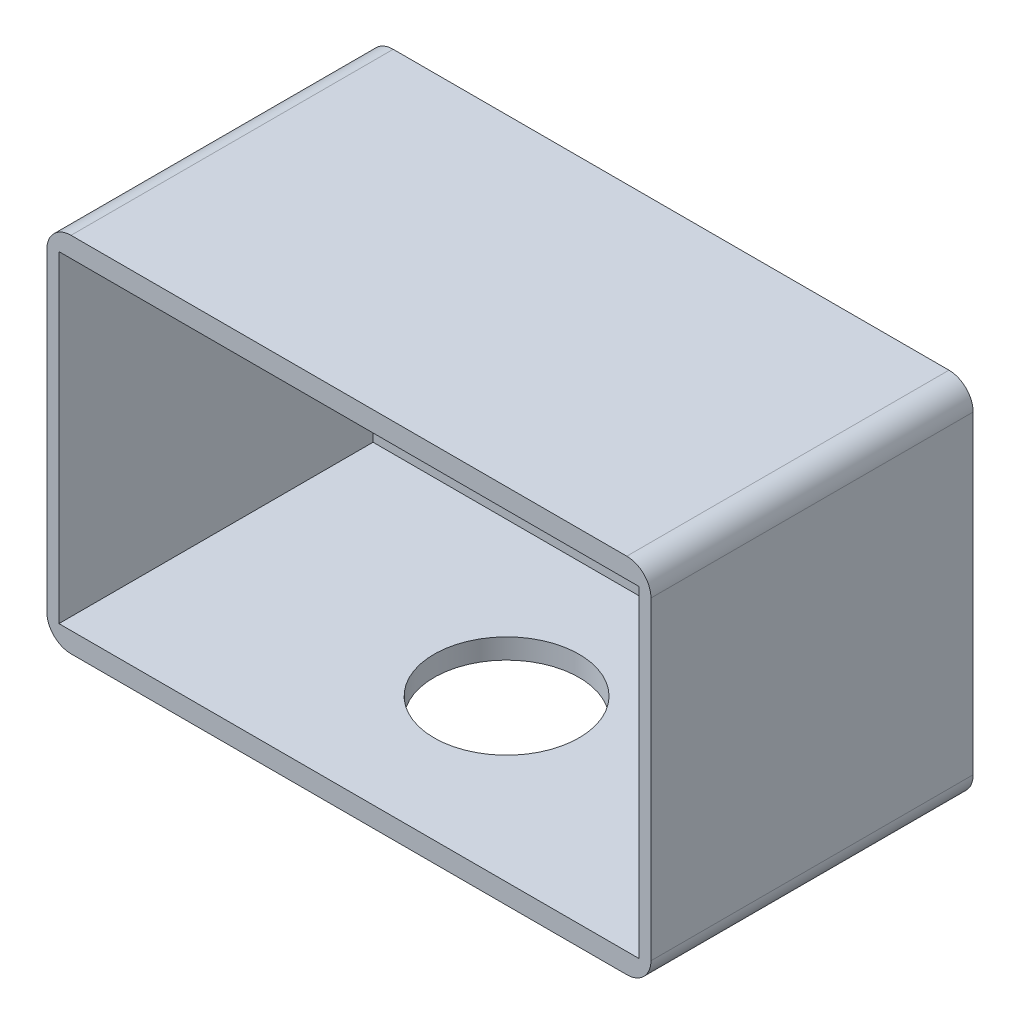
ISO-10303-21;
HEADER;
FILE_DESCRIPTION(('STEP AP214'),'2;1');
FILE_NAME('part.step','',(''),(''),'','','');
FILE_SCHEMA(('AUTOMOTIVE_DESIGN { 1 0 10303 214 1 1 1 1 }'));
ENDSEC;
DATA;
#1=APPLICATION_CONTEXT('core data for automotive mechanical design processes');
#2=APPLICATION_PROTOCOL_DEFINITION('international standard','automotive_design',2000,#1);
#3=PRODUCT_CONTEXT('',#1,'mechanical');
#4=PRODUCT('Part','Part','',(#3));
#5=PRODUCT_RELATED_PRODUCT_CATEGORY('part','',(#4));
#6=PRODUCT_DEFINITION_FORMATION('','',#4);
#7=PRODUCT_DEFINITION_CONTEXT('part definition',#1,'design');
#8=PRODUCT_DEFINITION('design','',#6,#7);
#9=PRODUCT_DEFINITION_SHAPE('','',#8);
#10=(LENGTH_UNIT() NAMED_UNIT(*) SI_UNIT(.MILLI.,.METRE.));
#11=(NAMED_UNIT(*) PLANE_ANGLE_UNIT() SI_UNIT($,.RADIAN.));
#12=(NAMED_UNIT(*) SI_UNIT($,.STERADIAN.) SOLID_ANGLE_UNIT());
#13=UNCERTAINTY_MEASURE_WITH_UNIT(LENGTH_MEASURE(1.E-05),#10,'distance_accuracy_value','');
#14=(GEOMETRIC_REPRESENTATION_CONTEXT(3) GLOBAL_UNCERTAINTY_ASSIGNED_CONTEXT((#13)) GLOBAL_UNIT_ASSIGNED_CONTEXT((#10,
#11,#12)) REPRESENTATION_CONTEXT('',''));
#15=CARTESIAN_POINT('',(0.,0.,0.));
#16=DIRECTION('',(0.,0.,1.));
#17=DIRECTION('',(1.,0.,0.));
#18=AXIS2_PLACEMENT_3D('',#15,#16,#17);
#19=CARTESIAN_POINT('',(36.,-20.,40.));
#20=DIRECTION('',(-1.,0.,0.));
#21=DIRECTION('',(0.,0.,1.));
#22=AXIS2_PLACEMENT_3D('',#19,#20,#21);
#23=PLANE('',#22);
#24=DIRECTION('',(0.,0.,-1.));
#25=VECTOR('',#24,1.);
#26=CARTESIAN_POINT('',(36.,20.,40.));
#27=LINE('',#26,#25);
#28=CARTESIAN_POINT('',(36.,20.,40.));
#29=VERTEX_POINT('',#28);
#30=CARTESIAN_POINT('',(36.,20.,1.));
#31=VERTEX_POINT('',#30);
#32=EDGE_CURVE('E134',#29,#31,#27,.T.);
#33=ORIENTED_EDGE('',*,*,#32,.T.);
#34=DIRECTION('',(0.,1.,0.));
#35=VECTOR('',#34,1.);
#36=CARTESIAN_POINT('',(36.,-20.,1.));
#37=LINE('',#36,#35);
#38=CARTESIAN_POINT('',(36.,-20.,1.));
#39=VERTEX_POINT('',#38);
#40=EDGE_CURVE('E120',#39,#31,#37,.T.);
#41=ORIENTED_EDGE('',*,*,#40,.F.);
#42=DIRECTION('',(0.,0.,-1.));
#43=VECTOR('',#42,1.);
#44=CARTESIAN_POINT('',(36.,-20.,40.));
#45=LINE('',#44,#43);
#46=CARTESIAN_POINT('',(36.,-20.,40.));
#47=VERTEX_POINT('',#46);
#48=EDGE_CURVE('E284',#47,#39,#45,.T.);
#49=ORIENTED_EDGE('',*,*,#48,.F.);
#50=DIRECTION('',(0.,1.,0.));
#51=VECTOR('',#50,1.);
#52=CARTESIAN_POINT('',(36.,-20.,40.));
#53=LINE('',#52,#51);
#54=EDGE_CURVE('E140',#47,#29,#53,.T.);
#55=ORIENTED_EDGE('',*,*,#54,.T.);
#56=EDGE_LOOP('',(#33,#41,#49,#55));
#57=FACE_BOUND('',#56,.T.);
#58=ADVANCED_FACE('F33',(#57),#23,.T.);
#59=CARTESIAN_POINT('',(-36.,20.,40.));
#60=DIRECTION('',(0.,-1.,0.));
#61=DIRECTION('',(0.,0.,-1.));
#62=AXIS2_PLACEMENT_3D('',#59,#60,#61);
#63=PLANE('',#62);
#64=DIRECTION('',(0.,0.,-1.));
#65=VECTOR('',#64,1.);
#66=CARTESIAN_POINT('',(-36.,20.,40.));
#67=LINE('',#66,#65);
#68=CARTESIAN_POINT('',(-36.,20.,40.));
#69=VERTEX_POINT('',#68);
#70=CARTESIAN_POINT('',(-36.,20.,1.));
#71=VERTEX_POINT('',#70);
#72=EDGE_CURVE('E137',#69,#71,#67,.T.);
#73=ORIENTED_EDGE('',*,*,#72,.T.);
#74=DIRECTION('',(-1.,0.,0.));
#75=VECTOR('',#74,1.);
#76=CARTESIAN_POINT('',(-36.,20.,1.));
#77=LINE('',#76,#75);
#78=EDGE_CURVE('E123',#31,#71,#77,.T.);
#79=ORIENTED_EDGE('',*,*,#78,.F.);
#80=ORIENTED_EDGE('',*,*,#32,.F.);
#81=DIRECTION('',(-1.,0.,0.));
#82=VECTOR('',#81,1.);
#83=CARTESIAN_POINT('',(-36.,20.,40.));
#84=LINE('',#83,#82);
#85=EDGE_CURVE('E290',#29,#69,#84,.T.);
#86=ORIENTED_EDGE('',*,*,#85,.T.);
#87=EDGE_LOOP('',(#73,#79,#80,#86));
#88=FACE_BOUND('',#87,.T.);
#89=ADVANCED_FACE('F133',(#88),#63,.T.);
#90=CARTESIAN_POINT('',(-36.,-20.,40.));
#91=DIRECTION('',(1.,0.,0.));
#92=DIRECTION('',(0.,0.,-1.));
#93=AXIS2_PLACEMENT_3D('',#90,#91,#92);
#94=PLANE('',#93);
#95=DIRECTION('',(0.,0.,-1.));
#96=VECTOR('',#95,1.);
#97=CARTESIAN_POINT('',(-36.,-20.,40.));
#98=LINE('',#97,#96);
#99=CARTESIAN_POINT('',(-36.,-20.,40.));
#100=VERTEX_POINT('',#99);
#101=CARTESIAN_POINT('',(-36.,-20.,1.));
#102=VERTEX_POINT('',#101);
#103=EDGE_CURVE('E55',#100,#102,#98,.T.);
#104=ORIENTED_EDGE('',*,*,#103,.T.);
#105=DIRECTION('',(0.,-1.,0.));
#106=VECTOR('',#105,1.);
#107=CARTESIAN_POINT('',(-36.,-20.,1.));
#108=LINE('',#107,#106);
#109=EDGE_CURVE('E48',#71,#102,#108,.T.);
#110=ORIENTED_EDGE('',*,*,#109,.F.);
#111=ORIENTED_EDGE('',*,*,#72,.F.);
#112=DIRECTION('',(0.,-1.,0.));
#113=VECTOR('',#112,1.);
#114=CARTESIAN_POINT('',(-36.,-20.,40.));
#115=LINE('',#114,#113);
#116=EDGE_CURVE('E282',#69,#100,#115,.T.);
#117=ORIENTED_EDGE('',*,*,#116,.T.);
#118=EDGE_LOOP('',(#104,#110,#111,#117));
#119=FACE_BOUND('',#118,.T.);
#120=ADVANCED_FACE('F252',(#119),#94,.T.);
#121=CARTESIAN_POINT('',(-36.,-20.,40.));
#122=DIRECTION('',(0.,1.,0.));
#123=DIRECTION('',(0.,0.,1.));
#124=AXIS2_PLACEMENT_3D('',#121,#122,#123);
#125=PLANE('',#124);
#126=CARTESIAN_POINT('',(-0.425108749877515,-20.,20.));
#127=DIRECTION('',(0.,1.,0.));
#128=DIRECTION('',(0.,0.,1.));
#129=AXIS2_PLACEMENT_3D('',#126,#127,#128);
#130=CIRCLE('',#129,9.);
#131=CARTESIAN_POINT('',(-0.425108749877515,-20.,29.));
#132=VERTEX_POINT('',#131);
#133=EDGE_CURVE('E296',#132,#132,#130,.T.);
#134=ORIENTED_EDGE('',*,*,#133,.F.);
#135=EDGE_LOOP('',(#134));
#136=FACE_BOUND('',#135,.T.);
#137=ORIENTED_EDGE('',*,*,#48,.T.);
#138=DIRECTION('',(1.,0.,0.));
#139=VECTOR('',#138,1.);
#140=CARTESIAN_POINT('',(-36.,-20.,1.));
#141=LINE('',#140,#139);
#142=EDGE_CURVE('E124',#102,#39,#141,.T.);
#143=ORIENTED_EDGE('',*,*,#142,.F.);
#144=ORIENTED_EDGE('',*,*,#103,.F.);
#145=DIRECTION('',(1.,0.,0.));
#146=VECTOR('',#145,1.);
#147=CARTESIAN_POINT('',(-36.,-20.,40.));
#148=LINE('',#147,#146);
#149=EDGE_CURVE('E285',#100,#47,#148,.T.);
#150=ORIENTED_EDGE('',*,*,#149,.T.);
#151=EDGE_LOOP('',(#137,#143,#144,#150));
#152=FACE_BOUND('',#151,.T.);
#153=ADVANCED_FACE('F258',(#136,#152),#125,.T.);
#154=CARTESIAN_POINT('',(-34.5,-19.5,40.));
#155=DIRECTION('',(0.,0.,-1.));
#156=DIRECTION('',(-1.,0.,0.));
#157=AXIS2_PLACEMENT_3D('',#154,#155,#156);
#158=PLANE('',#157);
#159=CARTESIAN_POINT('',(-34.5,-19.5,40.));
#160=DIRECTION('',(0.,0.,1.));
#161=DIRECTION('',(-1.,0.,0.));
#162=AXIS2_PLACEMENT_3D('',#159,#160,#161);
#163=CIRCLE('',#162,3.);
#164=CARTESIAN_POINT('',(-37.5,-19.5,40.));
#165=VERTEX_POINT('',#164);
#166=CARTESIAN_POINT('',(-34.5,-22.5,40.));
#167=VERTEX_POINT('',#166);
#168=EDGE_CURVE('E149',#165,#167,#163,.T.);
#169=ORIENTED_EDGE('',*,*,#168,.T.);
#170=DIRECTION('',(1.,0.,0.));
#171=VECTOR('',#170,1.);
#172=CARTESIAN_POINT('',(-34.5,-22.5,40.));
#173=LINE('',#172,#171);
#174=CARTESIAN_POINT('',(34.5,-22.5,40.));
#175=VERTEX_POINT('',#174);
#176=EDGE_CURVE('E152',#167,#175,#173,.T.);
#177=ORIENTED_EDGE('',*,*,#176,.T.);
#178=CARTESIAN_POINT('',(34.5,-19.5,40.));
#179=DIRECTION('',(0.,0.,1.));
#180=DIRECTION('',(1.,0.,0.));
#181=AXIS2_PLACEMENT_3D('',#178,#179,#180);
#182=CIRCLE('',#181,3.);
#183=CARTESIAN_POINT('',(37.5,-19.5,40.));
#184=VERTEX_POINT('',#183);
#185=EDGE_CURVE('E155',#175,#184,#182,.T.);
#186=ORIENTED_EDGE('',*,*,#185,.T.);
#187=DIRECTION('',(0.,1.,0.));
#188=VECTOR('',#187,1.);
#189=CARTESIAN_POINT('',(37.5,-19.5,40.));
#190=LINE('',#189,#188);
#191=CARTESIAN_POINT('',(37.5,19.5,40.));
#192=VERTEX_POINT('',#191);
#193=EDGE_CURVE('E157',#184,#192,#190,.T.);
#194=ORIENTED_EDGE('',*,*,#193,.T.);
#195=CARTESIAN_POINT('',(34.5,19.5,40.));
#196=DIRECTION('',(0.,0.,1.));
#197=DIRECTION('',(-1.,0.,0.));
#198=AXIS2_PLACEMENT_3D('',#195,#196,#197);
#199=CIRCLE('',#198,3.);
#200=CARTESIAN_POINT('',(34.5,22.5,40.));
#201=VERTEX_POINT('',#200);
#202=EDGE_CURVE('E159',#192,#201,#199,.T.);
#203=ORIENTED_EDGE('',*,*,#202,.T.);
#204=DIRECTION('',(-1.,0.,0.));
#205=VECTOR('',#204,1.);
#206=CARTESIAN_POINT('',(-34.5,22.5,40.));
#207=LINE('',#206,#205);
#208=CARTESIAN_POINT('',(-34.5,22.5,40.));
#209=VERTEX_POINT('',#208);
#210=EDGE_CURVE('E161',#201,#209,#207,.T.);
#211=ORIENTED_EDGE('',*,*,#210,.T.);
#212=CARTESIAN_POINT('',(-34.5,19.5,40.));
#213=DIRECTION('',(0.,0.,1.));
#214=DIRECTION('',(-1.,0.,0.));
#215=AXIS2_PLACEMENT_3D('',#212,#213,#214);
#216=CIRCLE('',#215,3.);
#217=CARTESIAN_POINT('',(-37.5,19.5,40.));
#218=VERTEX_POINT('',#217);
#219=EDGE_CURVE('E163',#209,#218,#216,.T.);
#220=ORIENTED_EDGE('',*,*,#219,.T.);
#221=DIRECTION('',(0.,-1.,0.));
#222=VECTOR('',#221,1.);
#223=CARTESIAN_POINT('',(-37.5,-19.5,40.));
#224=LINE('',#223,#222);
#225=EDGE_CURVE('E165',#218,#165,#224,.T.);
#226=ORIENTED_EDGE('',*,*,#225,.T.);
#227=EDGE_LOOP('',(#169,#177,#186,#194,#203,#211,#220,#226));
#228=FACE_BOUND('',#227,.T.);
#229=ORIENTED_EDGE('',*,*,#54,.F.);
#230=ORIENTED_EDGE('',*,*,#149,.F.);
#231=ORIENTED_EDGE('',*,*,#116,.F.);
#232=ORIENTED_EDGE('',*,*,#85,.F.);
#233=EDGE_LOOP('',(#229,#230,#231,#232));
#234=FACE_BOUND('',#233,.T.);
#235=ADVANCED_FACE('F220',(#228,#234),#158,.F.);
#236=CARTESIAN_POINT('',(-34.5,-19.5,0.));
#237=DIRECTION('',(0.,0.,-1.));
#238=DIRECTION('',(-1.,0.,0.));
#239=AXIS2_PLACEMENT_3D('',#236,#237,#238);
#240=PLANE('',#239);
#241=CARTESIAN_POINT('',(-34.5,-19.5,0.));
#242=DIRECTION('',(0.,0.,1.));
#243=DIRECTION('',(-1.,0.,0.));
#244=AXIS2_PLACEMENT_3D('',#241,#242,#243);
#245=CIRCLE('',#244,3.);
#246=CARTESIAN_POINT('',(-37.5,-19.5,0.));
#247=VERTEX_POINT('',#246);
#248=CARTESIAN_POINT('',(-34.5,-22.5,0.));
#249=VERTEX_POINT('',#248);
#250=EDGE_CURVE('E141',#247,#249,#245,.T.);
#251=ORIENTED_EDGE('',*,*,#250,.F.);
#252=DIRECTION('',(0.,-1.,0.));
#253=VECTOR('',#252,1.);
#254=CARTESIAN_POINT('',(-37.5,-19.5,0.));
#255=LINE('',#254,#253);
#256=CARTESIAN_POINT('',(-37.5,19.5,0.));
#257=VERTEX_POINT('',#256);
#258=EDGE_CURVE('E153',#257,#247,#255,.T.);
#259=ORIENTED_EDGE('',*,*,#258,.F.);
#260=CARTESIAN_POINT('',(-34.5,19.5,0.));
#261=DIRECTION('',(0.,0.,1.));
#262=DIRECTION('',(-1.,0.,0.));
#263=AXIS2_PLACEMENT_3D('',#260,#261,#262);
#264=CIRCLE('',#263,3.);
#265=CARTESIAN_POINT('',(-34.5,22.5,0.));
#266=VERTEX_POINT('',#265);
#267=EDGE_CURVE('E177',#266,#257,#264,.T.);
#268=ORIENTED_EDGE('',*,*,#267,.F.);
#269=DIRECTION('',(-1.,0.,0.));
#270=VECTOR('',#269,1.);
#271=CARTESIAN_POINT('',(-34.5,22.5,0.));
#272=LINE('',#271,#270);
#273=CARTESIAN_POINT('',(34.5,22.5,0.));
#274=VERTEX_POINT('',#273);
#275=EDGE_CURVE('E175',#274,#266,#272,.T.);
#276=ORIENTED_EDGE('',*,*,#275,.F.);
#277=CARTESIAN_POINT('',(34.5,19.5,0.));
#278=DIRECTION('',(0.,0.,1.));
#279=DIRECTION('',(-1.,0.,0.));
#280=AXIS2_PLACEMENT_3D('',#277,#278,#279);
#281=CIRCLE('',#280,3.);
#282=CARTESIAN_POINT('',(37.5,19.5,0.));
#283=VERTEX_POINT('',#282);
#284=EDGE_CURVE('E173',#283,#274,#281,.T.);
#285=ORIENTED_EDGE('',*,*,#284,.F.);
#286=DIRECTION('',(0.,1.,0.));
#287=VECTOR('',#286,1.);
#288=CARTESIAN_POINT('',(37.5,-19.5,0.));
#289=LINE('',#288,#287);
#290=CARTESIAN_POINT('',(37.5,-19.5,0.));
#291=VERTEX_POINT('',#290);
#292=EDGE_CURVE('E171',#291,#283,#289,.T.);
#293=ORIENTED_EDGE('',*,*,#292,.F.);
#294=CARTESIAN_POINT('',(34.5,-19.5,0.));
#295=DIRECTION('',(0.,0.,1.));
#296=DIRECTION('',(1.,0.,0.));
#297=AXIS2_PLACEMENT_3D('',#294,#295,#296);
#298=CIRCLE('',#297,3.);
#299=CARTESIAN_POINT('',(34.5,-22.5,0.));
#300=VERTEX_POINT('',#299);
#301=EDGE_CURVE('E169',#300,#291,#298,.T.);
#302=ORIENTED_EDGE('',*,*,#301,.F.);
#303=DIRECTION('',(1.,0.,0.));
#304=VECTOR('',#303,1.);
#305=CARTESIAN_POINT('',(-34.5,-22.5,0.));
#306=LINE('',#305,#304);
#307=EDGE_CURVE('E144',#249,#300,#306,.T.);
#308=ORIENTED_EDGE('',*,*,#307,.F.);
#309=EDGE_LOOP('',(#251,#259,#268,#276,#285,#293,#302,#308));
#310=FACE_BOUND('',#309,.T.);
#311=ADVANCED_FACE('F207',(#310),#240,.T.);
#312=CARTESIAN_POINT('',(-34.5,-19.5,40.));
#313=DIRECTION('',(0.,0.,-1.));
#314=DIRECTION('',(-1.,0.,0.));
#315=AXIS2_PLACEMENT_3D('',#312,#313,#314);
#316=CYLINDRICAL_SURFACE('',#315,3.);
#317=ORIENTED_EDGE('',*,*,#250,.T.);
#318=DIRECTION('',(0.,0.,-1.));
#319=VECTOR('',#318,1.);
#320=CARTESIAN_POINT('',(-34.5,-22.5,40.));
#321=LINE('',#320,#319);
#322=EDGE_CURVE('E11',#167,#249,#321,.T.);
#323=ORIENTED_EDGE('',*,*,#322,.F.);
#324=ORIENTED_EDGE('',*,*,#168,.F.);
#325=DIRECTION('',(0.,0.,-1.));
#326=VECTOR('',#325,1.);
#327=CARTESIAN_POINT('',(-37.5,-19.5,40.));
#328=LINE('',#327,#326);
#329=EDGE_CURVE('E166',#165,#247,#328,.T.);
#330=ORIENTED_EDGE('',*,*,#329,.T.);
#331=EDGE_LOOP('',(#317,#323,#324,#330));
#332=FACE_BOUND('',#331,.T.);
#333=ADVANCED_FACE('F35',(#332),#316,.T.);
#334=CARTESIAN_POINT('',(-34.5,-22.5,40.));
#335=DIRECTION('',(0.,1.,0.));
#336=DIRECTION('',(0.,0.,1.));
#337=AXIS2_PLACEMENT_3D('',#334,#335,#336);
#338=PLANE('',#337);
#339=CARTESIAN_POINT('',(-0.425108749877515,-22.5,20.));
#340=DIRECTION('',(0.,1.,0.));
#341=DIRECTION('',(0.,0.,1.));
#342=AXIS2_PLACEMENT_3D('',#339,#340,#341);
#343=CIRCLE('',#342,9.);
#344=CARTESIAN_POINT('',(-0.425108749877515,-22.5,29.));
#345=VERTEX_POINT('',#344);
#346=EDGE_CURVE('E293',#345,#345,#343,.T.);
#347=ORIENTED_EDGE('',*,*,#346,.T.);
#348=EDGE_LOOP('',(#347));
#349=FACE_BOUND('',#348,.T.);
#350=ORIENTED_EDGE('',*,*,#307,.T.);
#351=DIRECTION('',(0.,0.,-1.));
#352=VECTOR('',#351,1.);
#353=CARTESIAN_POINT('',(34.5,-22.5,40.));
#354=LINE('',#353,#352);
#355=EDGE_CURVE('E41',#175,#300,#354,.T.);
#356=ORIENTED_EDGE('',*,*,#355,.F.);
#357=ORIENTED_EDGE('',*,*,#176,.F.);
#358=ORIENTED_EDGE('',*,*,#322,.T.);
#359=EDGE_LOOP('',(#350,#356,#357,#358));
#360=FACE_BOUND('',#359,.T.);
#361=ADVANCED_FACE('F225',(#349,#360),#338,.F.);
#362=CARTESIAN_POINT('',(34.5,-19.5,40.));
#363=DIRECTION('',(0.,0.,-1.));
#364=DIRECTION('',(-1.,0.,0.));
#365=AXIS2_PLACEMENT_3D('',#362,#363,#364);
#366=CYLINDRICAL_SURFACE('',#365,3.);
#367=ORIENTED_EDGE('',*,*,#301,.T.);
#368=DIRECTION('',(0.,0.,-1.));
#369=VECTOR('',#368,1.);
#370=CARTESIAN_POINT('',(37.5,-19.5,40.));
#371=LINE('',#370,#369);
#372=EDGE_CURVE('E194',#184,#291,#371,.T.);
#373=ORIENTED_EDGE('',*,*,#372,.F.);
#374=ORIENTED_EDGE('',*,*,#185,.F.);
#375=ORIENTED_EDGE('',*,*,#355,.T.);
#376=EDGE_LOOP('',(#367,#373,#374,#375));
#377=FACE_BOUND('',#376,.T.);
#378=ADVANCED_FACE('F201',(#377),#366,.T.);
#379=CARTESIAN_POINT('',(37.5,-19.5,40.));
#380=DIRECTION('',(-1.,0.,0.));
#381=DIRECTION('',(0.,0.,1.));
#382=AXIS2_PLACEMENT_3D('',#379,#380,#381);
#383=PLANE('',#382);
#384=ORIENTED_EDGE('',*,*,#292,.T.);
#385=DIRECTION('',(0.,0.,-1.));
#386=VECTOR('',#385,1.);
#387=CARTESIAN_POINT('',(37.5,19.5,40.));
#388=LINE('',#387,#386);
#389=EDGE_CURVE('E191',#192,#283,#388,.T.);
#390=ORIENTED_EDGE('',*,*,#389,.F.);
#391=ORIENTED_EDGE('',*,*,#193,.F.);
#392=ORIENTED_EDGE('',*,*,#372,.T.);
#393=EDGE_LOOP('',(#384,#390,#391,#392));
#394=FACE_BOUND('',#393,.T.);
#395=ADVANCED_FACE('F212',(#394),#383,.F.);
#396=CARTESIAN_POINT('',(34.5,19.5,40.));
#397=DIRECTION('',(0.,0.,-1.));
#398=DIRECTION('',(-1.,0.,0.));
#399=AXIS2_PLACEMENT_3D('',#396,#397,#398);
#400=CYLINDRICAL_SURFACE('',#399,3.);
#401=ORIENTED_EDGE('',*,*,#284,.T.);
#402=DIRECTION('',(0.,0.,-1.));
#403=VECTOR('',#402,1.);
#404=CARTESIAN_POINT('',(34.5,22.5,40.));
#405=LINE('',#404,#403);
#406=EDGE_CURVE('E188',#201,#274,#405,.T.);
#407=ORIENTED_EDGE('',*,*,#406,.F.);
#408=ORIENTED_EDGE('',*,*,#202,.F.);
#409=ORIENTED_EDGE('',*,*,#389,.T.);
#410=EDGE_LOOP('',(#401,#407,#408,#409));
#411=FACE_BOUND('',#410,.T.);
#412=ADVANCED_FACE('F216',(#411),#400,.T.);
#413=CARTESIAN_POINT('',(-34.5,22.5,40.));
#414=DIRECTION('',(0.,-1.,0.));
#415=DIRECTION('',(0.,0.,-1.));
#416=AXIS2_PLACEMENT_3D('',#413,#414,#415);
#417=PLANE('',#416);
#418=ORIENTED_EDGE('',*,*,#275,.T.);
#419=DIRECTION('',(0.,0.,-1.));
#420=VECTOR('',#419,1.);
#421=CARTESIAN_POINT('',(-34.5,22.5,40.));
#422=LINE('',#421,#420);
#423=EDGE_CURVE('E185',#209,#266,#422,.T.);
#424=ORIENTED_EDGE('',*,*,#423,.F.);
#425=ORIENTED_EDGE('',*,*,#210,.F.);
#426=ORIENTED_EDGE('',*,*,#406,.T.);
#427=EDGE_LOOP('',(#418,#424,#425,#426));
#428=FACE_BOUND('',#427,.T.);
#429=ADVANCED_FACE('F238',(#428),#417,.F.);
#430=CARTESIAN_POINT('',(-34.5,19.5,40.));
#431=DIRECTION('',(0.,0.,-1.));
#432=DIRECTION('',(-1.,0.,0.));
#433=AXIS2_PLACEMENT_3D('',#430,#431,#432);
#434=CYLINDRICAL_SURFACE('',#433,3.);
#435=ORIENTED_EDGE('',*,*,#267,.T.);
#436=DIRECTION('',(0.,0.,-1.));
#437=VECTOR('',#436,1.);
#438=CARTESIAN_POINT('',(-37.5,19.5,40.));
#439=LINE('',#438,#437);
#440=EDGE_CURVE('E182',#218,#257,#439,.T.);
#441=ORIENTED_EDGE('',*,*,#440,.F.);
#442=ORIENTED_EDGE('',*,*,#219,.F.);
#443=ORIENTED_EDGE('',*,*,#423,.T.);
#444=EDGE_LOOP('',(#435,#441,#442,#443));
#445=FACE_BOUND('',#444,.T.);
#446=ADVANCED_FACE('F236',(#445),#434,.T.);
#447=CARTESIAN_POINT('',(-37.5,-19.5,40.));
#448=DIRECTION('',(1.,0.,0.));
#449=DIRECTION('',(0.,0.,-1.));
#450=AXIS2_PLACEMENT_3D('',#447,#448,#449);
#451=PLANE('',#450);
#452=ORIENTED_EDGE('',*,*,#258,.T.);
#453=ORIENTED_EDGE('',*,*,#329,.F.);
#454=ORIENTED_EDGE('',*,*,#225,.F.);
#455=ORIENTED_EDGE('',*,*,#440,.T.);
#456=EDGE_LOOP('',(#452,#453,#454,#455));
#457=FACE_BOUND('',#456,.T.);
#458=ADVANCED_FACE('F231',(#457),#451,.F.);
#459=CARTESIAN_POINT('',(-0.425108749877515,-24.,20.));
#460=DIRECTION('',(0.,1.,0.));
#461=DIRECTION('',(0.,0.,1.));
#462=AXIS2_PLACEMENT_3D('',#459,#460,#461);
#463=CYLINDRICAL_SURFACE('',#462,9.);
#464=ORIENTED_EDGE('',*,*,#133,.T.);
#465=EDGE_LOOP('',(#464));
#466=FACE_BOUND('',#465,.T.);
#467=ORIENTED_EDGE('',*,*,#346,.F.);
#468=EDGE_LOOP('',(#467));
#469=FACE_BOUND('',#468,.T.);
#470=ADVANCED_FACE('F262',(#466,#469),#463,.F.);
#471=CARTESIAN_POINT('',(0.,0.,1.));
#472=DIRECTION('',(0.,0.,-1.));
#473=DIRECTION('',(-1.,0.,0.));
#474=AXIS2_PLACEMENT_3D('',#471,#472,#473);
#475=PLANE('',#474);
#476=ORIENTED_EDGE('',*,*,#40,.T.);
#477=ORIENTED_EDGE('',*,*,#78,.T.);
#478=ORIENTED_EDGE('',*,*,#109,.T.);
#479=ORIENTED_EDGE('',*,*,#142,.T.);
#480=EDGE_LOOP('',(#476,#477,#478,#479));
#481=FACE_BOUND('',#480,.T.);
#482=ADVANCED_FACE('F122',(#481),#475,.F.);
#483=CLOSED_SHELL('',(#58,#89,#120,#153,#235,#311,#333,#361,#378,#395,#412,#429,#446,#458,#470,#482));
#484=MANIFOLD_SOLID_BREP('B2',#483);
#485=ADVANCED_BREP_SHAPE_REPRESENTATION('',(#18,#484),#14);
#486=SHAPE_DEFINITION_REPRESENTATION(#9,#485);
ENDSEC;
END-ISO-10303-21;
